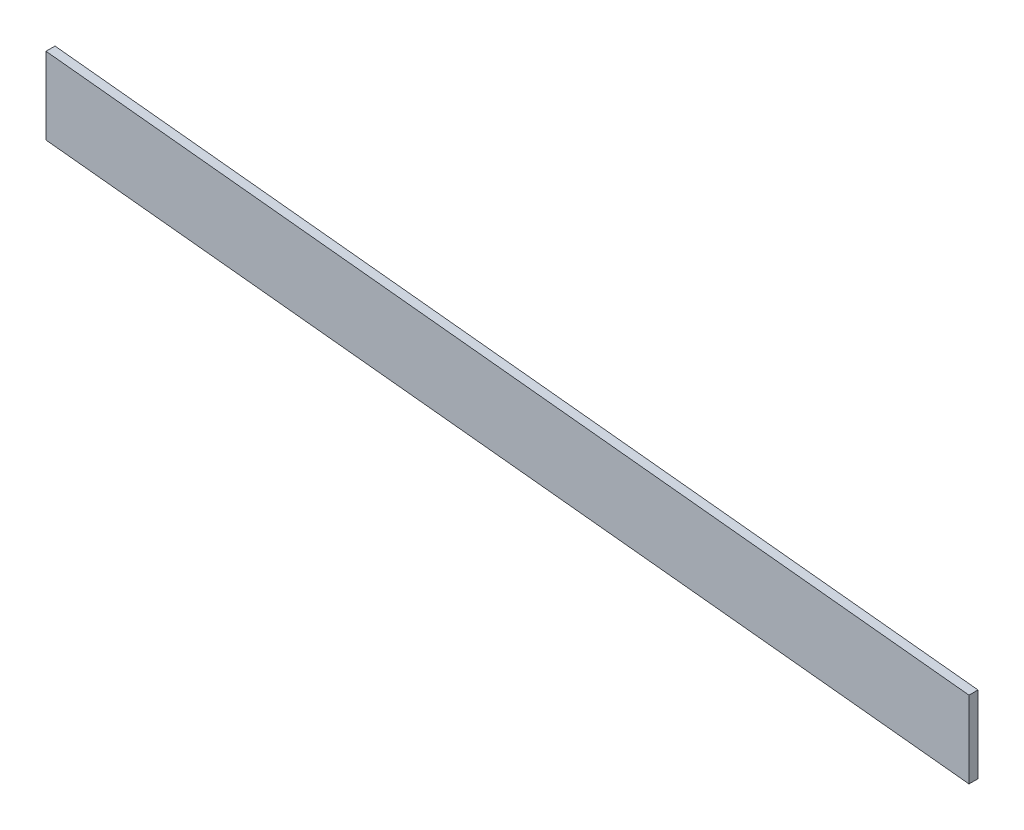
ISO-10303-21;
HEADER;
FILE_DESCRIPTION(('STEP AP214'),'2;1');
FILE_NAME('part.step','',(''),(''),'','','');
FILE_SCHEMA(('AUTOMOTIVE_DESIGN { 1 0 10303 214 1 1 1 1 }'));
ENDSEC;
DATA;
#1=APPLICATION_CONTEXT('core data for automotive mechanical design processes');
#2=APPLICATION_PROTOCOL_DEFINITION('international standard','automotive_design',2000,#1);
#3=PRODUCT_CONTEXT('',#1,'mechanical');
#4=PRODUCT('Part','Part','',(#3));
#5=PRODUCT_RELATED_PRODUCT_CATEGORY('part','',(#4));
#6=PRODUCT_DEFINITION_FORMATION('','',#4);
#7=PRODUCT_DEFINITION_CONTEXT('part definition',#1,'design');
#8=PRODUCT_DEFINITION('design','',#6,#7);
#9=PRODUCT_DEFINITION_SHAPE('','',#8);
#10=(LENGTH_UNIT() NAMED_UNIT(*) SI_UNIT(.MILLI.,.METRE.));
#11=(NAMED_UNIT(*) PLANE_ANGLE_UNIT() SI_UNIT($,.RADIAN.));
#12=(NAMED_UNIT(*) SI_UNIT($,.STERADIAN.) SOLID_ANGLE_UNIT());
#13=UNCERTAINTY_MEASURE_WITH_UNIT(LENGTH_MEASURE(1.E-05),#10,'distance_accuracy_value','');
#14=(GEOMETRIC_REPRESENTATION_CONTEXT(3) GLOBAL_UNCERTAINTY_ASSIGNED_CONTEXT((#13)) GLOBAL_UNIT_ASSIGNED_CONTEXT((#10,
#11,#12)) REPRESENTATION_CONTEXT('',''));
#15=CARTESIAN_POINT('',(0.,0.,0.));
#16=DIRECTION('',(0.,0.,1.));
#17=DIRECTION('',(1.,0.,0.));
#18=AXIS2_PLACEMENT_3D('',#15,#16,#17);
#19=CARTESIAN_POINT('',(-609.6,114.3,11.90625));
#20=DIRECTION('',(-0.103606084259456,-0.994618408890778,0.));
#21=DIRECTION('',(0.994618408890778,-0.103606084259456,0.));
#22=AXIS2_PLACEMENT_3D('',#19,#20,#21);
#23=PLANE('',#22);
#24=DIRECTION('',(-0.994618408890778,0.103606084259456,0.));
#25=VECTOR('',#24,1.);
#26=CARTESIAN_POINT('',(-609.6,114.3,0.));
#27=LINE('',#26,#25);
#28=CARTESIAN_POINT('',(609.6,-12.7,0.));
#29=VERTEX_POINT('',#28);
#30=CARTESIAN_POINT('',(-609.6,114.3,0.));
#31=VERTEX_POINT('',#30);
#32=EDGE_CURVE('E96',#29,#31,#27,.T.);
#33=ORIENTED_EDGE('',*,*,#32,.T.);
#34=DIRECTION('',(0.,0.,-1.));
#35=VECTOR('',#34,1.);
#36=CARTESIAN_POINT('',(-609.6,114.3,11.90625));
#37=LINE('',#36,#35);
#38=CARTESIAN_POINT('',(-609.6,114.3,11.90625));
#39=VERTEX_POINT('',#38);
#40=EDGE_CURVE('E11',#39,#31,#37,.T.);
#41=ORIENTED_EDGE('',*,*,#40,.F.);
#42=DIRECTION('',(-0.994618408890778,0.103606084259456,0.));
#43=VECTOR('',#42,1.);
#44=CARTESIAN_POINT('',(-609.6,114.3,11.90625));
#45=LINE('',#44,#43);
#46=CARTESIAN_POINT('',(609.6,-12.7,11.90625));
#47=VERTEX_POINT('',#46);
#48=EDGE_CURVE('E84',#47,#39,#45,.T.);
#49=ORIENTED_EDGE('',*,*,#48,.F.);
#50=DIRECTION('',(0.,0.,-1.));
#51=VECTOR('',#50,1.);
#52=CARTESIAN_POINT('',(609.6,-12.7,11.90625));
#53=LINE('',#52,#51);
#54=EDGE_CURVE('E92',#47,#29,#53,.T.);
#55=ORIENTED_EDGE('',*,*,#54,.T.);
#56=EDGE_LOOP('',(#33,#41,#49,#55));
#57=FACE_BOUND('',#56,.T.);
#58=ADVANCED_FACE('F33',(#57),#23,.F.);
#59=CARTESIAN_POINT('',(-609.6,114.3,11.90625));
#60=DIRECTION('',(1.,0.,0.));
#61=DIRECTION('',(0.,0.,-1.));
#62=AXIS2_PLACEMENT_3D('',#59,#60,#61);
#63=PLANE('',#62);
#64=DIRECTION('',(0.,-1.,0.));
#65=VECTOR('',#64,1.);
#66=CARTESIAN_POINT('',(-609.6,114.3,0.));
#67=LINE('',#66,#65);
#68=CARTESIAN_POINT('',(-609.6,12.6999999999999,0.));
#69=VERTEX_POINT('',#68);
#70=EDGE_CURVE('E88',#31,#69,#67,.T.);
#71=ORIENTED_EDGE('',*,*,#70,.T.);
#72=DIRECTION('',(0.,0.,-1.));
#73=VECTOR('',#72,1.);
#74=CARTESIAN_POINT('',(-609.6,12.6999999999999,11.90625));
#75=LINE('',#74,#73);
#76=CARTESIAN_POINT('',(-609.6,12.6999999999999,11.90625));
#77=VERTEX_POINT('',#76);
#78=EDGE_CURVE('E41',#77,#69,#75,.T.);
#79=ORIENTED_EDGE('',*,*,#78,.F.);
#80=DIRECTION('',(0.,-1.,0.));
#81=VECTOR('',#80,1.);
#82=CARTESIAN_POINT('',(-609.6,114.3,11.90625));
#83=LINE('',#82,#81);
#84=EDGE_CURVE('E79',#39,#77,#83,.T.);
#85=ORIENTED_EDGE('',*,*,#84,.F.);
#86=ORIENTED_EDGE('',*,*,#40,.T.);
#87=EDGE_LOOP('',(#71,#79,#85,#86));
#88=FACE_BOUND('',#87,.T.);
#89=ADVANCED_FACE('F87',(#88),#63,.F.);
#90=CARTESIAN_POINT('',(-609.6,12.6999999999999,11.90625));
#91=DIRECTION('',(0.103606084259456,0.994618408890778,0.));
#92=DIRECTION('',(-0.994618408890778,0.103606084259456,0.));
#93=AXIS2_PLACEMENT_3D('',#90,#91,#92);
#94=PLANE('',#93);
#95=DIRECTION('',(0.994618408890778,-0.103606084259456,0.));
#96=VECTOR('',#95,1.);
#97=CARTESIAN_POINT('',(-609.6,12.6999999999999,0.));
#98=LINE('',#97,#96);
#99=CARTESIAN_POINT('',(609.6,-114.3,0.));
#100=VERTEX_POINT('',#99);
#101=EDGE_CURVE('E66',#69,#100,#98,.T.);
#102=ORIENTED_EDGE('',*,*,#101,.T.);
#103=DIRECTION('',(0.,0.,-1.));
#104=VECTOR('',#103,1.);
#105=CARTESIAN_POINT('',(609.6,-114.3,11.90625));
#106=LINE('',#105,#104);
#107=CARTESIAN_POINT('',(609.6,-114.3,11.90625));
#108=VERTEX_POINT('',#107);
#109=EDGE_CURVE('E89',#108,#100,#106,.T.);
#110=ORIENTED_EDGE('',*,*,#109,.F.);
#111=DIRECTION('',(0.994618408890778,-0.103606084259456,0.));
#112=VECTOR('',#111,1.);
#113=CARTESIAN_POINT('',(-609.6,12.6999999999999,11.90625));
#114=LINE('',#113,#112);
#115=EDGE_CURVE('E82',#77,#108,#114,.T.);
#116=ORIENTED_EDGE('',*,*,#115,.F.);
#117=ORIENTED_EDGE('',*,*,#78,.T.);
#118=EDGE_LOOP('',(#102,#110,#116,#117));
#119=FACE_BOUND('',#118,.T.);
#120=ADVANCED_FACE('F90',(#119),#94,.F.);
#121=CARTESIAN_POINT('',(609.6,-114.3,11.90625));
#122=DIRECTION('',(-1.,0.,0.));
#123=DIRECTION('',(0.,0.,1.));
#124=AXIS2_PLACEMENT_3D('',#121,#122,#123);
#125=PLANE('',#124);
#126=DIRECTION('',(0.,1.,0.));
#127=VECTOR('',#126,1.);
#128=CARTESIAN_POINT('',(609.6,-114.3,0.));
#129=LINE('',#128,#127);
#130=EDGE_CURVE('E72',#100,#29,#129,.T.);
#131=ORIENTED_EDGE('',*,*,#130,.T.);
#132=ORIENTED_EDGE('',*,*,#54,.F.);
#133=DIRECTION('',(0.,1.,0.));
#134=VECTOR('',#133,1.);
#135=CARTESIAN_POINT('',(609.6,-114.3,11.90625));
#136=LINE('',#135,#134);
#137=EDGE_CURVE('E49',#108,#47,#136,.T.);
#138=ORIENTED_EDGE('',*,*,#137,.F.);
#139=ORIENTED_EDGE('',*,*,#109,.T.);
#140=EDGE_LOOP('',(#131,#132,#138,#139));
#141=FACE_BOUND('',#140,.T.);
#142=ADVANCED_FACE('F103',(#141),#125,.F.);
#143=CARTESIAN_POINT('',(0.,0.,11.90625));
#144=DIRECTION('',(0.,0.,1.));
#145=DIRECTION('',(1.,0.,0.));
#146=AXIS2_PLACEMENT_3D('',#143,#144,#145);
#147=PLANE('',#146);
#148=ORIENTED_EDGE('',*,*,#48,.T.);
#149=ORIENTED_EDGE('',*,*,#84,.T.);
#150=ORIENTED_EDGE('',*,*,#115,.T.);
#151=ORIENTED_EDGE('',*,*,#137,.T.);
#152=EDGE_LOOP('',(#148,#149,#150,#151));
#153=FACE_BOUND('',#152,.T.);
#154=ADVANCED_FACE('F80',(#153),#147,.T.);
#155=CARTESIAN_POINT('',(0.,0.,0.));
#156=DIRECTION('',(0.,0.,1.));
#157=DIRECTION('',(1.,0.,0.));
#158=AXIS2_PLACEMENT_3D('',#155,#156,#157);
#159=PLANE('',#158);
#160=ORIENTED_EDGE('',*,*,#32,.F.);
#161=ORIENTED_EDGE('',*,*,#130,.F.);
#162=ORIENTED_EDGE('',*,*,#101,.F.);
#163=ORIENTED_EDGE('',*,*,#70,.F.);
#164=EDGE_LOOP('',(#160,#161,#162,#163));
#165=FACE_BOUND('',#164,.T.);
#166=ADVANCED_FACE('F106',(#165),#159,.F.);
#167=CLOSED_SHELL('',(#58,#89,#120,#142,#154,#166));
#168=MANIFOLD_SOLID_BREP('B2',#167);
#169=ADVANCED_BREP_SHAPE_REPRESENTATION('',(#18,#168),#14);
#170=SHAPE_DEFINITION_REPRESENTATION(#9,#169);
ENDSEC;
END-ISO-10303-21;
